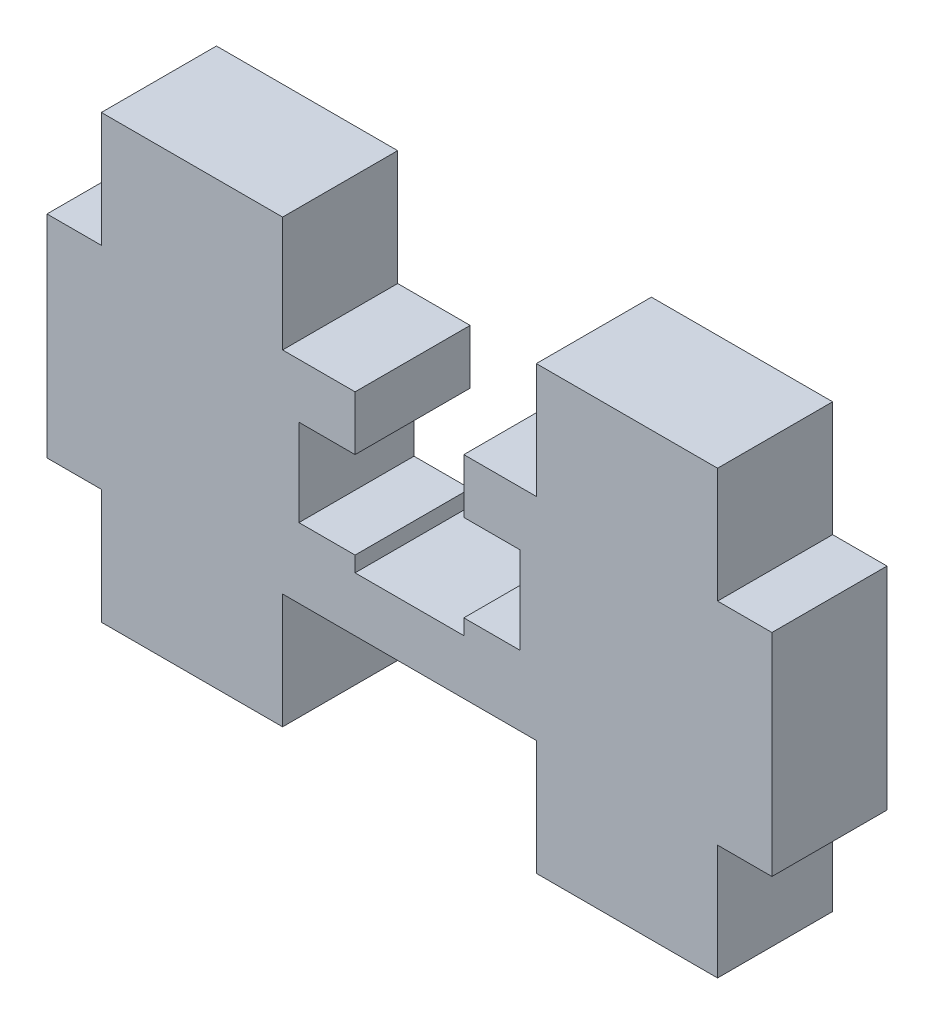
ISO-10303-21;
HEADER;
FILE_DESCRIPTION(('STEP AP214'),'2;1');
FILE_NAME('part.step','',(''),(''),'','','');
FILE_SCHEMA(('AUTOMOTIVE_DESIGN { 1 0 10303 214 1 1 1 1 }'));
ENDSEC;
DATA;
#1=APPLICATION_CONTEXT('core data for automotive mechanical design processes');
#2=APPLICATION_PROTOCOL_DEFINITION('international standard','automotive_design',2000,#1);
#3=PRODUCT_CONTEXT('',#1,'mechanical');
#4=PRODUCT('Part','Part','',(#3));
#5=PRODUCT_RELATED_PRODUCT_CATEGORY('part','',(#4));
#6=PRODUCT_DEFINITION_FORMATION('','',#4);
#7=PRODUCT_DEFINITION_CONTEXT('part definition',#1,'design');
#8=PRODUCT_DEFINITION('design','',#6,#7);
#9=PRODUCT_DEFINITION_SHAPE('','',#8);
#10=(LENGTH_UNIT() NAMED_UNIT(*) SI_UNIT(.MILLI.,.METRE.));
#11=(NAMED_UNIT(*) PLANE_ANGLE_UNIT() SI_UNIT($,.RADIAN.));
#12=(NAMED_UNIT(*) SI_UNIT($,.STERADIAN.) SOLID_ANGLE_UNIT());
#13=UNCERTAINTY_MEASURE_WITH_UNIT(LENGTH_MEASURE(1.E-05),#10,'distance_accuracy_value','');
#14=(GEOMETRIC_REPRESENTATION_CONTEXT(3) GLOBAL_UNCERTAINTY_ASSIGNED_CONTEXT((#13)) GLOBAL_UNIT_ASSIGNED_CONTEXT((#10,
#11,#12)) REPRESENTATION_CONTEXT('',''));
#15=CARTESIAN_POINT('',(0.,0.,0.));
#16=DIRECTION('',(0.,0.,1.));
#17=DIRECTION('',(1.,0.,0.));
#18=AXIS2_PLACEMENT_3D('',#15,#16,#17);
#19=CARTESIAN_POINT('',(-3.5,2.915,3.175));
#20=DIRECTION('',(0.,-1.,0.));
#21=DIRECTION('',(1.,0.,0.));
#22=AXIS2_PLACEMENT_3D('',#19,#20,#21);
#23=PLANE('',#22);
#24=DIRECTION('',(-1.,0.,0.));
#25=VECTOR('',#24,1.);
#26=CARTESIAN_POINT('',(-3.5,2.915,0.));
#27=LINE('',#26,#25);
#28=CARTESIAN_POINT('',(3.5,2.915,0.));
#29=VERTEX_POINT('',#28);
#30=CARTESIAN_POINT('',(1.5,2.915,0.));
#31=VERTEX_POINT('',#30);
#32=EDGE_CURVE('E271',#29,#31,#27,.T.);
#33=ORIENTED_EDGE('',*,*,#32,.T.);
#34=DIRECTION('',(0.,0.,1.));
#35=VECTOR('',#34,1.);
#36=CARTESIAN_POINT('',(1.5,2.915,0.));
#37=LINE('',#36,#35);
#38=CARTESIAN_POINT('',(1.5,2.915,3.175));
#39=VERTEX_POINT('',#38);
#40=EDGE_CURVE('E231',#31,#39,#37,.T.);
#41=ORIENTED_EDGE('',*,*,#40,.T.);
#42=DIRECTION('',(-1.,0.,0.));
#43=VECTOR('',#42,1.);
#44=CARTESIAN_POINT('',(-3.5,2.915,3.175));
#45=LINE('',#44,#43);
#46=CARTESIAN_POINT('',(3.5,2.915,3.175));
#47=VERTEX_POINT('',#46);
#48=EDGE_CURVE('E410',#47,#39,#45,.T.);
#49=ORIENTED_EDGE('',*,*,#48,.F.);
#50=DIRECTION('',(0.,0.,-1.));
#51=VECTOR('',#50,1.);
#52=CARTESIAN_POINT('',(3.5,2.915,3.175));
#53=LINE('',#52,#51);
#54=EDGE_CURVE('E303',#47,#29,#53,.T.);
#55=ORIENTED_EDGE('',*,*,#54,.T.);
#56=EDGE_LOOP('',(#33,#41,#49,#55));
#57=FACE_BOUND('',#56,.T.);
#58=ADVANCED_FACE('F39',(#57),#23,.F.);
#59=CARTESIAN_POINT('',(-10.,-2.915,3.175));
#60=DIRECTION('',(0.,1.,0.));
#61=DIRECTION('',(0.,0.,1.));
#62=AXIS2_PLACEMENT_3D('',#59,#60,#61);
#63=PLANE('',#62);
#64=DIRECTION('',(1.,0.,0.));
#65=VECTOR('',#64,1.);
#66=CARTESIAN_POINT('',(-10.,-2.915,0.));
#67=LINE('',#66,#65);
#68=CARTESIAN_POINT('',(-10.,-2.915,0.));
#69=VERTEX_POINT('',#68);
#70=CARTESIAN_POINT('',(-8.5,-2.915,0.));
#71=VERTEX_POINT('',#70);
#72=EDGE_CURVE('E226',#69,#71,#67,.T.);
#73=ORIENTED_EDGE('',*,*,#72,.T.);
#74=DIRECTION('',(0.,0.,-1.));
#75=VECTOR('',#74,1.);
#76=CARTESIAN_POINT('',(-8.5,-2.915,3.175));
#77=LINE('',#76,#75);
#78=CARTESIAN_POINT('',(-8.5,-2.915,3.175));
#79=VERTEX_POINT('',#78);
#80=EDGE_CURVE('E11',#79,#71,#77,.T.);
#81=ORIENTED_EDGE('',*,*,#80,.F.);
#82=DIRECTION('',(1.,0.,0.));
#83=VECTOR('',#82,1.);
#84=CARTESIAN_POINT('',(-10.,-2.915,3.175));
#85=LINE('',#84,#83);
#86=CARTESIAN_POINT('',(-10.,-2.915,3.175));
#87=VERTEX_POINT('',#86);
#88=EDGE_CURVE('E288',#87,#79,#85,.T.);
#89=ORIENTED_EDGE('',*,*,#88,.F.);
#90=DIRECTION('',(0.,0.,-1.));
#91=VECTOR('',#90,1.);
#92=CARTESIAN_POINT('',(-10.,-2.915,3.175));
#93=LINE('',#92,#91);
#94=EDGE_CURVE('E222',#87,#69,#93,.T.);
#95=ORIENTED_EDGE('',*,*,#94,.T.);
#96=EDGE_LOOP('',(#73,#81,#89,#95));
#97=FACE_BOUND('',#96,.T.);
#98=ADVANCED_FACE('F41',(#97),#63,.F.);
#99=CARTESIAN_POINT('',(-8.5,-2.915,3.175));
#100=DIRECTION('',(1.,0.,0.));
#101=DIRECTION('',(0.,1.,0.));
#102=AXIS2_PLACEMENT_3D('',#99,#100,#101);
#103=PLANE('',#102);
#104=DIRECTION('',(0.,-1.,0.));
#105=VECTOR('',#104,1.);
#106=CARTESIAN_POINT('',(-8.5,-2.915,0.));
#107=LINE('',#106,#105);
#108=CARTESIAN_POINT('',(-8.5,-6.09,0.));
#109=VERTEX_POINT('',#108);
#110=EDGE_CURVE('E230',#71,#109,#107,.T.);
#111=ORIENTED_EDGE('',*,*,#110,.T.);
#112=DIRECTION('',(0.,0.,-1.));
#113=VECTOR('',#112,1.);
#114=CARTESIAN_POINT('',(-8.5,-6.09,3.175));
#115=LINE('',#114,#113);
#116=CARTESIAN_POINT('',(-8.5,-6.09,3.175));
#117=VERTEX_POINT('',#116);
#118=EDGE_CURVE('E48',#117,#109,#115,.T.);
#119=ORIENTED_EDGE('',*,*,#118,.F.);
#120=DIRECTION('',(0.,-1.,0.));
#121=VECTOR('',#120,1.);
#122=CARTESIAN_POINT('',(-8.5,-2.915,3.175));
#123=LINE('',#122,#121);
#124=EDGE_CURVE('E141',#79,#117,#123,.T.);
#125=ORIENTED_EDGE('',*,*,#124,.F.);
#126=ORIENTED_EDGE('',*,*,#80,.T.);
#127=EDGE_LOOP('',(#111,#119,#125,#126));
#128=FACE_BOUND('',#127,.T.);
#129=ADVANCED_FACE('F683',(#128),#103,.F.);
#130=CARTESIAN_POINT('',(-8.5,-6.09,3.175));
#131=DIRECTION('',(0.,1.,0.));
#132=DIRECTION('',(-1.,0.,0.));
#133=AXIS2_PLACEMENT_3D('',#130,#131,#132);
#134=PLANE('',#133);
#135=DIRECTION('',(1.,0.,0.));
#136=VECTOR('',#135,1.);
#137=CARTESIAN_POINT('',(-8.5,-6.09,0.));
#138=LINE('',#137,#136);
#139=CARTESIAN_POINT('',(-3.5,-6.09,0.));
#140=VERTEX_POINT('',#139);
#141=EDGE_CURVE('E234',#109,#140,#138,.T.);
#142=ORIENTED_EDGE('',*,*,#141,.T.);
#143=DIRECTION('',(0.,0.,-1.));
#144=VECTOR('',#143,1.);
#145=CARTESIAN_POINT('',(-3.5,-6.09,3.175));
#146=LINE('',#145,#144);
#147=CARTESIAN_POINT('',(-3.5,-6.09,3.175));
#148=VERTEX_POINT('',#147);
#149=EDGE_CURVE('E347',#148,#140,#146,.T.);
#150=ORIENTED_EDGE('',*,*,#149,.F.);
#151=DIRECTION('',(1.,0.,0.));
#152=VECTOR('',#151,1.);
#153=CARTESIAN_POINT('',(-8.5,-6.09,3.175));
#154=LINE('',#153,#152);
#155=EDGE_CURVE('E357',#117,#148,#154,.T.);
#156=ORIENTED_EDGE('',*,*,#155,.F.);
#157=ORIENTED_EDGE('',*,*,#118,.T.);
#158=EDGE_LOOP('',(#142,#150,#156,#157));
#159=FACE_BOUND('',#158,.T.);
#160=ADVANCED_FACE('F355',(#159),#134,.F.);
#161=CARTESIAN_POINT('',(-3.5,-6.09,3.175));
#162=DIRECTION('',(-1.,0.,0.));
#163=DIRECTION('',(0.,-1.,0.));
#164=AXIS2_PLACEMENT_3D('',#161,#162,#163);
#165=PLANE('',#164);
#166=DIRECTION('',(0.,1.,0.));
#167=VECTOR('',#166,1.);
#168=CARTESIAN_POINT('',(-3.5,-6.09,0.));
#169=LINE('',#168,#167);
#170=CARTESIAN_POINT('',(-3.5,-2.915,0.));
#171=VERTEX_POINT('',#170);
#172=EDGE_CURVE('E237',#140,#171,#169,.T.);
#173=ORIENTED_EDGE('',*,*,#172,.T.);
#174=DIRECTION('',(0.,0.,-1.));
#175=VECTOR('',#174,1.);
#176=CARTESIAN_POINT('',(-3.5,-2.915,3.175));
#177=LINE('',#176,#175);
#178=CARTESIAN_POINT('',(-3.5,-2.915,3.175));
#179=VERTEX_POINT('',#178);
#180=EDGE_CURVE('E343',#179,#171,#177,.T.);
#181=ORIENTED_EDGE('',*,*,#180,.F.);
#182=DIRECTION('',(0.,1.,0.));
#183=VECTOR('',#182,1.);
#184=CARTESIAN_POINT('',(-3.5,-6.09,3.175));
#185=LINE('',#184,#183);
#186=EDGE_CURVE('E377',#148,#179,#185,.T.);
#187=ORIENTED_EDGE('',*,*,#186,.F.);
#188=ORIENTED_EDGE('',*,*,#149,.T.);
#189=EDGE_LOOP('',(#173,#181,#187,#188));
#190=FACE_BOUND('',#189,.T.);
#191=ADVANCED_FACE('F367',(#190),#165,.F.);
#192=CARTESIAN_POINT('',(-3.5,-2.915,3.175));
#193=DIRECTION('',(0.,1.,0.));
#194=DIRECTION('',(-1.,0.,0.));
#195=AXIS2_PLACEMENT_3D('',#192,#193,#194);
#196=PLANE('',#195);
#197=DIRECTION('',(1.,0.,0.));
#198=VECTOR('',#197,1.);
#199=CARTESIAN_POINT('',(-3.5,-2.915,0.));
#200=LINE('',#199,#198);
#201=CARTESIAN_POINT('',(3.5,-2.915,0.));
#202=VERTEX_POINT('',#201);
#203=EDGE_CURVE('E240',#171,#202,#200,.T.);
#204=ORIENTED_EDGE('',*,*,#203,.T.);
#205=DIRECTION('',(0.,0.,-1.));
#206=VECTOR('',#205,1.);
#207=CARTESIAN_POINT('',(3.5,-2.915,3.175));
#208=LINE('',#207,#206);
#209=CARTESIAN_POINT('',(3.5,-2.915,3.175));
#210=VERTEX_POINT('',#209);
#211=EDGE_CURVE('E339',#210,#202,#208,.T.);
#212=ORIENTED_EDGE('',*,*,#211,.F.);
#213=DIRECTION('',(1.,0.,0.));
#214=VECTOR('',#213,1.);
#215=CARTESIAN_POINT('',(-3.5,-2.915,3.175));
#216=LINE('',#215,#214);
#217=EDGE_CURVE('E373',#179,#210,#216,.T.);
#218=ORIENTED_EDGE('',*,*,#217,.F.);
#219=ORIENTED_EDGE('',*,*,#180,.T.);
#220=EDGE_LOOP('',(#204,#212,#218,#219));
#221=FACE_BOUND('',#220,.T.);
#222=ADVANCED_FACE('F371',(#221),#196,.F.);
#223=CARTESIAN_POINT('',(3.5,-6.09,3.175));
#224=DIRECTION('',(1.,0.,0.));
#225=DIRECTION('',(0.,1.,0.));
#226=AXIS2_PLACEMENT_3D('',#223,#224,#225);
#227=PLANE('',#226);
#228=DIRECTION('',(0.,-1.,0.));
#229=VECTOR('',#228,1.);
#230=CARTESIAN_POINT('',(3.5,-6.09,0.));
#231=LINE('',#230,#229);
#232=CARTESIAN_POINT('',(3.5,-6.09,0.));
#233=VERTEX_POINT('',#232);
#234=EDGE_CURVE('E243',#202,#233,#231,.T.);
#235=ORIENTED_EDGE('',*,*,#234,.T.);
#236=DIRECTION('',(0.,0.,-1.));
#237=VECTOR('',#236,1.);
#238=CARTESIAN_POINT('',(3.5,-6.09,3.175));
#239=LINE('',#238,#237);
#240=CARTESIAN_POINT('',(3.5,-6.09,3.175));
#241=VERTEX_POINT('',#240);
#242=EDGE_CURVE('E335',#241,#233,#239,.T.);
#243=ORIENTED_EDGE('',*,*,#242,.F.);
#244=DIRECTION('',(0.,-1.,0.));
#245=VECTOR('',#244,1.);
#246=CARTESIAN_POINT('',(3.5,-6.09,3.175));
#247=LINE('',#246,#245);
#248=EDGE_CURVE('E376',#210,#241,#247,.T.);
#249=ORIENTED_EDGE('',*,*,#248,.F.);
#250=ORIENTED_EDGE('',*,*,#211,.T.);
#251=EDGE_LOOP('',(#235,#243,#249,#250));
#252=FACE_BOUND('',#251,.T.);
#253=ADVANCED_FACE('F723',(#252),#227,.F.);
#254=CARTESIAN_POINT('',(8.5,-6.09,3.175));
#255=DIRECTION('',(0.,1.,0.));
#256=DIRECTION('',(-1.,0.,0.));
#257=AXIS2_PLACEMENT_3D('',#254,#255,#256);
#258=PLANE('',#257);
#259=DIRECTION('',(1.,0.,0.));
#260=VECTOR('',#259,1.);
#261=CARTESIAN_POINT('',(8.5,-6.09,0.));
#262=LINE('',#261,#260);
#263=CARTESIAN_POINT('',(8.5,-6.09,0.));
#264=VERTEX_POINT('',#263);
#265=EDGE_CURVE('E246',#233,#264,#262,.T.);
#266=ORIENTED_EDGE('',*,*,#265,.T.);
#267=DIRECTION('',(0.,0.,-1.));
#268=VECTOR('',#267,1.);
#269=CARTESIAN_POINT('',(8.5,-6.09,3.175));
#270=LINE('',#269,#268);
#271=CARTESIAN_POINT('',(8.5,-6.09,3.175));
#272=VERTEX_POINT('',#271);
#273=EDGE_CURVE('E331',#272,#264,#270,.T.);
#274=ORIENTED_EDGE('',*,*,#273,.F.);
#275=DIRECTION('',(1.,0.,0.));
#276=VECTOR('',#275,1.);
#277=CARTESIAN_POINT('',(8.5,-6.09,3.175));
#278=LINE('',#277,#276);
#279=EDGE_CURVE('E381',#241,#272,#278,.T.);
#280=ORIENTED_EDGE('',*,*,#279,.F.);
#281=ORIENTED_EDGE('',*,*,#242,.T.);
#282=EDGE_LOOP('',(#266,#274,#280,#281));
#283=FACE_BOUND('',#282,.T.);
#284=ADVANCED_FACE('F719',(#283),#258,.F.);
#285=CARTESIAN_POINT('',(8.5,-2.915,3.175));
#286=DIRECTION('',(-1.,0.,0.));
#287=DIRECTION('',(0.,-1.,0.));
#288=AXIS2_PLACEMENT_3D('',#285,#286,#287);
#289=PLANE('',#288);
#290=DIRECTION('',(0.,1.,0.));
#291=VECTOR('',#290,1.);
#292=CARTESIAN_POINT('',(8.5,-2.915,0.));
#293=LINE('',#292,#291);
#294=CARTESIAN_POINT('',(8.5,-2.915,0.));
#295=VERTEX_POINT('',#294);
#296=EDGE_CURVE('E249',#264,#295,#293,.T.);
#297=ORIENTED_EDGE('',*,*,#296,.T.);
#298=DIRECTION('',(0.,0.,-1.));
#299=VECTOR('',#298,1.);
#300=CARTESIAN_POINT('',(8.5,-2.915,3.175));
#301=LINE('',#300,#299);
#302=CARTESIAN_POINT('',(8.5,-2.915,3.175));
#303=VERTEX_POINT('',#302);
#304=EDGE_CURVE('E327',#303,#295,#301,.T.);
#305=ORIENTED_EDGE('',*,*,#304,.F.);
#306=DIRECTION('',(0.,1.,0.));
#307=VECTOR('',#306,1.);
#308=CARTESIAN_POINT('',(8.5,-2.915,3.175));
#309=LINE('',#308,#307);
#310=EDGE_CURVE('E388',#272,#303,#309,.T.);
#311=ORIENTED_EDGE('',*,*,#310,.F.);
#312=ORIENTED_EDGE('',*,*,#273,.T.);
#313=EDGE_LOOP('',(#297,#305,#311,#312));
#314=FACE_BOUND('',#313,.T.);
#315=ADVANCED_FACE('F715',(#314),#289,.F.);
#316=CARTESIAN_POINT('',(10.,-2.915,3.175));
#317=DIRECTION('',(0.,1.,0.));
#318=DIRECTION('',(-1.,0.,0.));
#319=AXIS2_PLACEMENT_3D('',#316,#317,#318);
#320=PLANE('',#319);
#321=DIRECTION('',(1.,0.,0.));
#322=VECTOR('',#321,1.);
#323=CARTESIAN_POINT('',(10.,-2.915,0.));
#324=LINE('',#323,#322);
#325=CARTESIAN_POINT('',(10.,-2.915,0.));
#326=VERTEX_POINT('',#325);
#327=EDGE_CURVE('E252',#295,#326,#324,.T.);
#328=ORIENTED_EDGE('',*,*,#327,.T.);
#329=DIRECTION('',(0.,0.,-1.));
#330=VECTOR('',#329,1.);
#331=CARTESIAN_POINT('',(10.,-2.915,3.175));
#332=LINE('',#331,#330);
#333=CARTESIAN_POINT('',(10.,-2.915,3.175));
#334=VERTEX_POINT('',#333);
#335=EDGE_CURVE('E323',#334,#326,#332,.T.);
#336=ORIENTED_EDGE('',*,*,#335,.F.);
#337=DIRECTION('',(1.,0.,0.));
#338=VECTOR('',#337,1.);
#339=CARTESIAN_POINT('',(10.,-2.915,3.175));
#340=LINE('',#339,#338);
#341=EDGE_CURVE('E391',#303,#334,#340,.T.);
#342=ORIENTED_EDGE('',*,*,#341,.F.);
#343=ORIENTED_EDGE('',*,*,#304,.T.);
#344=EDGE_LOOP('',(#328,#336,#342,#343));
#345=FACE_BOUND('',#344,.T.);
#346=ADVANCED_FACE('F711',(#345),#320,.F.);
#347=CARTESIAN_POINT('',(10.,2.915,3.175));
#348=DIRECTION('',(-1.,0.,0.));
#349=DIRECTION('',(0.,0.,1.));
#350=AXIS2_PLACEMENT_3D('',#347,#348,#349);
#351=PLANE('',#350);
#352=DIRECTION('',(0.,1.,0.));
#353=VECTOR('',#352,1.);
#354=CARTESIAN_POINT('',(10.,2.915,0.));
#355=LINE('',#354,#353);
#356=CARTESIAN_POINT('',(10.,2.915,0.));
#357=VERTEX_POINT('',#356);
#358=EDGE_CURVE('E255',#326,#357,#355,.T.);
#359=ORIENTED_EDGE('',*,*,#358,.T.);
#360=DIRECTION('',(0.,0.,-1.));
#361=VECTOR('',#360,1.);
#362=CARTESIAN_POINT('',(10.,2.915,3.175));
#363=LINE('',#362,#361);
#364=CARTESIAN_POINT('',(10.,2.915,3.175));
#365=VERTEX_POINT('',#364);
#366=EDGE_CURVE('E319',#365,#357,#363,.T.);
#367=ORIENTED_EDGE('',*,*,#366,.F.);
#368=DIRECTION('',(0.,1.,0.));
#369=VECTOR('',#368,1.);
#370=CARTESIAN_POINT('',(10.,2.915,3.175));
#371=LINE('',#370,#369);
#372=EDGE_CURVE('E394',#334,#365,#371,.T.);
#373=ORIENTED_EDGE('',*,*,#372,.F.);
#374=ORIENTED_EDGE('',*,*,#335,.T.);
#375=EDGE_LOOP('',(#359,#367,#373,#374));
#376=FACE_BOUND('',#375,.T.);
#377=ADVANCED_FACE('F707',(#376),#351,.F.);
#378=CARTESIAN_POINT('',(10.,2.915,3.175));
#379=DIRECTION('',(0.,-1.,0.));
#380=DIRECTION('',(1.,0.,0.));
#381=AXIS2_PLACEMENT_3D('',#378,#379,#380);
#382=PLANE('',#381);
#383=DIRECTION('',(-1.,0.,0.));
#384=VECTOR('',#383,1.);
#385=CARTESIAN_POINT('',(10.,2.915,0.));
#386=LINE('',#385,#384);
#387=CARTESIAN_POINT('',(8.5,2.915,0.));
#388=VERTEX_POINT('',#387);
#389=EDGE_CURVE('E258',#357,#388,#386,.T.);
#390=ORIENTED_EDGE('',*,*,#389,.T.);
#391=DIRECTION('',(0.,0.,-1.));
#392=VECTOR('',#391,1.);
#393=CARTESIAN_POINT('',(8.5,2.915,3.175));
#394=LINE('',#393,#392);
#395=CARTESIAN_POINT('',(8.5,2.915,3.175));
#396=VERTEX_POINT('',#395);
#397=EDGE_CURVE('E315',#396,#388,#394,.T.);
#398=ORIENTED_EDGE('',*,*,#397,.F.);
#399=DIRECTION('',(-1.,0.,0.));
#400=VECTOR('',#399,1.);
#401=CARTESIAN_POINT('',(10.,2.915,3.175));
#402=LINE('',#401,#400);
#403=EDGE_CURVE('E397',#365,#396,#402,.T.);
#404=ORIENTED_EDGE('',*,*,#403,.F.);
#405=ORIENTED_EDGE('',*,*,#366,.T.);
#406=EDGE_LOOP('',(#390,#398,#404,#405));
#407=FACE_BOUND('',#406,.T.);
#408=ADVANCED_FACE('F703',(#407),#382,.F.);
#409=CARTESIAN_POINT('',(8.5,2.915,3.175));
#410=DIRECTION('',(-1.,0.,0.));
#411=DIRECTION('',(0.,-1.,0.));
#412=AXIS2_PLACEMENT_3D('',#409,#410,#411);
#413=PLANE('',#412);
#414=DIRECTION('',(0.,1.,0.));
#415=VECTOR('',#414,1.);
#416=CARTESIAN_POINT('',(8.5,2.915,0.));
#417=LINE('',#416,#415);
#418=CARTESIAN_POINT('',(8.5,6.09,0.));
#419=VERTEX_POINT('',#418);
#420=EDGE_CURVE('E261',#388,#419,#417,.T.);
#421=ORIENTED_EDGE('',*,*,#420,.T.);
#422=DIRECTION('',(0.,0.,-1.));
#423=VECTOR('',#422,1.);
#424=CARTESIAN_POINT('',(8.5,6.09,3.175));
#425=LINE('',#424,#423);
#426=CARTESIAN_POINT('',(8.5,6.09,3.175));
#427=VERTEX_POINT('',#426);
#428=EDGE_CURVE('E311',#427,#419,#425,.T.);
#429=ORIENTED_EDGE('',*,*,#428,.F.);
#430=DIRECTION('',(0.,1.,0.));
#431=VECTOR('',#430,1.);
#432=CARTESIAN_POINT('',(8.5,2.915,3.175));
#433=LINE('',#432,#431);
#434=EDGE_CURVE('E400',#396,#427,#433,.T.);
#435=ORIENTED_EDGE('',*,*,#434,.F.);
#436=ORIENTED_EDGE('',*,*,#397,.T.);
#437=EDGE_LOOP('',(#421,#429,#435,#436));
#438=FACE_BOUND('',#437,.T.);
#439=ADVANCED_FACE('F697',(#438),#413,.F.);
#440=CARTESIAN_POINT('',(8.5,6.09,3.175));
#441=DIRECTION('',(0.,-1.,0.));
#442=DIRECTION('',(0.,0.,-1.));
#443=AXIS2_PLACEMENT_3D('',#440,#441,#442);
#444=PLANE('',#443);
#445=DIRECTION('',(-1.,0.,0.));
#446=VECTOR('',#445,1.);
#447=CARTESIAN_POINT('',(8.5,6.09,0.));
#448=LINE('',#447,#446);
#449=CARTESIAN_POINT('',(3.5,6.09,0.));
#450=VERTEX_POINT('',#449);
#451=EDGE_CURVE('E264',#419,#450,#448,.T.);
#452=ORIENTED_EDGE('',*,*,#451,.T.);
#453=DIRECTION('',(0.,0.,-1.));
#454=VECTOR('',#453,1.);
#455=CARTESIAN_POINT('',(3.5,6.09,3.175));
#456=LINE('',#455,#454);
#457=CARTESIAN_POINT('',(3.5,6.09,3.175));
#458=VERTEX_POINT('',#457);
#459=EDGE_CURVE('E307',#458,#450,#456,.T.);
#460=ORIENTED_EDGE('',*,*,#459,.F.);
#461=DIRECTION('',(-1.,0.,0.));
#462=VECTOR('',#461,1.);
#463=CARTESIAN_POINT('',(8.5,6.09,3.175));
#464=LINE('',#463,#462);
#465=EDGE_CURVE('E403',#427,#458,#464,.T.);
#466=ORIENTED_EDGE('',*,*,#465,.F.);
#467=ORIENTED_EDGE('',*,*,#428,.T.);
#468=EDGE_LOOP('',(#452,#460,#466,#467));
#469=FACE_BOUND('',#468,.T.);
#470=ADVANCED_FACE('F692',(#469),#444,.F.);
#471=CARTESIAN_POINT('',(3.5,6.09,3.175));
#472=DIRECTION('',(1.,0.,0.));
#473=DIRECTION('',(0.,0.,-1.));
#474=AXIS2_PLACEMENT_3D('',#471,#472,#473);
#475=PLANE('',#474);
#476=DIRECTION('',(0.,-1.,0.));
#477=VECTOR('',#476,1.);
#478=CARTESIAN_POINT('',(3.5,6.09,0.));
#479=LINE('',#478,#477);
#480=EDGE_CURVE('E267',#450,#29,#479,.T.);
#481=ORIENTED_EDGE('',*,*,#480,.T.);
#482=ORIENTED_EDGE('',*,*,#54,.F.);
#483=DIRECTION('',(0.,-1.,0.));
#484=VECTOR('',#483,1.);
#485=CARTESIAN_POINT('',(3.5,6.09,3.175));
#486=LINE('',#485,#484);
#487=EDGE_CURVE('E406',#458,#47,#486,.T.);
#488=ORIENTED_EDGE('',*,*,#487,.F.);
#489=ORIENTED_EDGE('',*,*,#459,.T.);
#490=EDGE_LOOP('',(#481,#482,#488,#489));
#491=FACE_BOUND('',#490,.T.);
#492=ADVANCED_FACE('F687',(#491),#475,.F.);
#493=CARTESIAN_POINT('',(-1.5,2.915,3.175));
#494=VERTEX_POINT('',#493);
#495=CARTESIAN_POINT('',(-3.5,2.915,3.175));
#496=VERTEX_POINT('',#495);
#497=EDGE_CURVE('E409',#494,#496,#45,.T.);
#498=ORIENTED_EDGE('',*,*,#497,.F.);
#499=DIRECTION('',(0.,0.,1.));
#500=VECTOR('',#499,1.);
#501=CARTESIAN_POINT('',(-1.5,2.915,0.));
#502=LINE('',#501,#500);
#503=CARTESIAN_POINT('',(-1.5,2.915,0.));
#504=VERTEX_POINT('',#503);
#505=EDGE_CURVE('E445',#504,#494,#502,.T.);
#506=ORIENTED_EDGE('',*,*,#505,.F.);
#507=CARTESIAN_POINT('',(-3.5,2.915,0.));
#508=VERTEX_POINT('',#507);
#509=EDGE_CURVE('E270',#504,#508,#27,.T.);
#510=ORIENTED_EDGE('',*,*,#509,.T.);
#511=DIRECTION('',(0.,0.,-1.));
#512=VECTOR('',#511,1.);
#513=CARTESIAN_POINT('',(-3.5,2.915,3.175));
#514=LINE('',#513,#512);
#515=EDGE_CURVE('E299',#496,#508,#514,.T.);
#516=ORIENTED_EDGE('',*,*,#515,.F.);
#517=EDGE_LOOP('',(#498,#506,#510,#516));
#518=FACE_BOUND('',#517,.T.);
#519=ADVANCED_FACE('F428',(#518),#23,.F.);
#520=CARTESIAN_POINT('',(-3.5,6.09,3.175));
#521=DIRECTION('',(-1.,0.,0.));
#522=DIRECTION('',(0.,-1.,0.));
#523=AXIS2_PLACEMENT_3D('',#520,#521,#522);
#524=PLANE('',#523);
#525=DIRECTION('',(0.,1.,0.));
#526=VECTOR('',#525,1.);
#527=CARTESIAN_POINT('',(-3.5,6.09,0.));
#528=LINE('',#527,#526);
#529=CARTESIAN_POINT('',(-3.5,6.09,0.));
#530=VERTEX_POINT('',#529);
#531=EDGE_CURVE('E275',#508,#530,#528,.T.);
#532=ORIENTED_EDGE('',*,*,#531,.T.);
#533=DIRECTION('',(0.,0.,-1.));
#534=VECTOR('',#533,1.);
#535=CARTESIAN_POINT('',(-3.5,6.09,3.175));
#536=LINE('',#535,#534);
#537=CARTESIAN_POINT('',(-3.5,6.09,3.175));
#538=VERTEX_POINT('',#537);
#539=EDGE_CURVE('E295',#538,#530,#536,.T.);
#540=ORIENTED_EDGE('',*,*,#539,.F.);
#541=DIRECTION('',(0.,1.,0.));
#542=VECTOR('',#541,1.);
#543=CARTESIAN_POINT('',(-3.5,6.09,3.175));
#544=LINE('',#543,#542);
#545=EDGE_CURVE('E413',#496,#538,#544,.T.);
#546=ORIENTED_EDGE('',*,*,#545,.F.);
#547=ORIENTED_EDGE('',*,*,#515,.T.);
#548=EDGE_LOOP('',(#532,#540,#546,#547));
#549=FACE_BOUND('',#548,.T.);
#550=ADVANCED_FACE('F432',(#549),#524,.F.);
#551=CARTESIAN_POINT('',(-8.5,6.09,3.175));
#552=DIRECTION('',(0.,-1.,0.));
#553=DIRECTION('',(1.,0.,0.));
#554=AXIS2_PLACEMENT_3D('',#551,#552,#553);
#555=PLANE('',#554);
#556=DIRECTION('',(-1.,0.,0.));
#557=VECTOR('',#556,1.);
#558=CARTESIAN_POINT('',(-8.5,6.09,0.));
#559=LINE('',#558,#557);
#560=CARTESIAN_POINT('',(-8.5,6.09,0.));
#561=VERTEX_POINT('',#560);
#562=EDGE_CURVE('E278',#530,#561,#559,.T.);
#563=ORIENTED_EDGE('',*,*,#562,.T.);
#564=DIRECTION('',(0.,0.,-1.));
#565=VECTOR('',#564,1.);
#566=CARTESIAN_POINT('',(-8.5,6.09,3.175));
#567=LINE('',#566,#565);
#568=CARTESIAN_POINT('',(-8.5,6.09,3.175));
#569=VERTEX_POINT('',#568);
#570=EDGE_CURVE('E215',#569,#561,#567,.T.);
#571=ORIENTED_EDGE('',*,*,#570,.F.);
#572=DIRECTION('',(-1.,0.,0.));
#573=VECTOR('',#572,1.);
#574=CARTESIAN_POINT('',(-8.5,6.09,3.175));
#575=LINE('',#574,#573);
#576=EDGE_CURVE('E201',#538,#569,#575,.T.);
#577=ORIENTED_EDGE('',*,*,#576,.F.);
#578=ORIENTED_EDGE('',*,*,#539,.T.);
#579=EDGE_LOOP('',(#563,#571,#577,#578));
#580=FACE_BOUND('',#579,.T.);
#581=ADVANCED_FACE('F435',(#580),#555,.F.);
#582=CARTESIAN_POINT('',(-8.5,2.915,3.175));
#583=DIRECTION('',(1.,0.,0.));
#584=DIRECTION('',(0.,1.,0.));
#585=AXIS2_PLACEMENT_3D('',#582,#583,#584);
#586=PLANE('',#585);
#587=DIRECTION('',(0.,-1.,0.));
#588=VECTOR('',#587,1.);
#589=CARTESIAN_POINT('',(-8.5,2.915,0.));
#590=LINE('',#589,#588);
#591=CARTESIAN_POINT('',(-8.5,2.915,0.));
#592=VERTEX_POINT('',#591);
#593=EDGE_CURVE('E211',#561,#592,#590,.T.);
#594=ORIENTED_EDGE('',*,*,#593,.T.);
#595=DIRECTION('',(0.,0.,-1.));
#596=VECTOR('',#595,1.);
#597=CARTESIAN_POINT('',(-8.5,2.915,3.175));
#598=LINE('',#597,#596);
#599=CARTESIAN_POINT('',(-8.5,2.915,3.175));
#600=VERTEX_POINT('',#599);
#601=EDGE_CURVE('E208',#600,#592,#598,.T.);
#602=ORIENTED_EDGE('',*,*,#601,.F.);
#603=DIRECTION('',(0.,-1.,0.));
#604=VECTOR('',#603,1.);
#605=CARTESIAN_POINT('',(-8.5,2.915,3.175));
#606=LINE('',#605,#604);
#607=EDGE_CURVE('E193',#569,#600,#606,.T.);
#608=ORIENTED_EDGE('',*,*,#607,.F.);
#609=ORIENTED_EDGE('',*,*,#570,.T.);
#610=EDGE_LOOP('',(#594,#602,#608,#609));
#611=FACE_BOUND('',#610,.T.);
#612=ADVANCED_FACE('F209',(#611),#586,.F.);
#613=CARTESIAN_POINT('',(-10.,2.915,3.175));
#614=DIRECTION('',(0.,-1.,0.));
#615=DIRECTION('',(1.,0.,0.));
#616=AXIS2_PLACEMENT_3D('',#613,#614,#615);
#617=PLANE('',#616);
#618=DIRECTION('',(-1.,0.,0.));
#619=VECTOR('',#618,1.);
#620=CARTESIAN_POINT('',(-10.,2.915,0.));
#621=LINE('',#620,#619);
#622=CARTESIAN_POINT('',(-10.,2.915,0.));
#623=VERTEX_POINT('',#622);
#624=EDGE_CURVE('E283',#592,#623,#621,.T.);
#625=ORIENTED_EDGE('',*,*,#624,.T.);
#626=DIRECTION('',(0.,0.,-1.));
#627=VECTOR('',#626,1.);
#628=CARTESIAN_POINT('',(-10.,2.915,3.175));
#629=LINE('',#628,#627);
#630=CARTESIAN_POINT('',(-10.,2.915,3.175));
#631=VERTEX_POINT('',#630);
#632=EDGE_CURVE('E216',#631,#623,#629,.T.);
#633=ORIENTED_EDGE('',*,*,#632,.F.);
#634=DIRECTION('',(-1.,0.,0.));
#635=VECTOR('',#634,1.);
#636=CARTESIAN_POINT('',(-10.,2.915,3.175));
#637=LINE('',#636,#635);
#638=EDGE_CURVE('E198',#600,#631,#637,.T.);
#639=ORIENTED_EDGE('',*,*,#638,.F.);
#640=ORIENTED_EDGE('',*,*,#601,.T.);
#641=EDGE_LOOP('',(#625,#633,#639,#640));
#642=FACE_BOUND('',#641,.T.);
#643=ADVANCED_FACE('F218',(#642),#617,.F.);
#644=CARTESIAN_POINT('',(-10.,2.915,3.175));
#645=DIRECTION('',(1.,0.,0.));
#646=DIRECTION('',(0.,0.,-1.));
#647=AXIS2_PLACEMENT_3D('',#644,#645,#646);
#648=PLANE('',#647);
#649=DIRECTION('',(0.,-1.,0.));
#650=VECTOR('',#649,1.);
#651=CARTESIAN_POINT('',(-10.,2.915,0.));
#652=LINE('',#651,#650);
#653=EDGE_CURVE('E133',#623,#69,#652,.T.);
#654=ORIENTED_EDGE('',*,*,#653,.T.);
#655=ORIENTED_EDGE('',*,*,#94,.F.);
#656=DIRECTION('',(0.,-1.,0.));
#657=VECTOR('',#656,1.);
#658=CARTESIAN_POINT('',(-10.,2.915,3.175));
#659=LINE('',#658,#657);
#660=EDGE_CURVE('E64',#631,#87,#659,.T.);
#661=ORIENTED_EDGE('',*,*,#660,.F.);
#662=ORIENTED_EDGE('',*,*,#632,.T.);
#663=EDGE_LOOP('',(#654,#655,#661,#662));
#664=FACE_BOUND('',#663,.T.);
#665=ADVANCED_FACE('F436',(#664),#648,.F.);
#666=CARTESIAN_POINT('',(0.,0.,3.175));
#667=DIRECTION('',(0.,0.,-1.));
#668=DIRECTION('',(-1.,0.,0.));
#669=AXIS2_PLACEMENT_3D('',#666,#667,#668);
#670=PLANE('',#669);
#671=ORIENTED_EDGE('',*,*,#48,.T.);
#672=DIRECTION('',(0.,1.,0.));
#673=VECTOR('',#672,1.);
#674=CARTESIAN_POINT('',(1.5,2.915,3.175));
#675=LINE('',#674,#673);
#676=CARTESIAN_POINT('',(1.5,1.415,3.175));
#677=VERTEX_POINT('',#676);
#678=EDGE_CURVE('E493',#677,#39,#675,.T.);
#679=ORIENTED_EDGE('',*,*,#678,.F.);
#680=DIRECTION('',(-1.,0.,0.));
#681=VECTOR('',#680,1.);
#682=CARTESIAN_POINT('',(1.5,1.415,3.175));
#683=LINE('',#682,#681);
#684=CARTESIAN_POINT('',(3.05,1.415,3.175));
#685=VERTEX_POINT('',#684);
#686=EDGE_CURVE('E498',#685,#677,#683,.T.);
#687=ORIENTED_EDGE('',*,*,#686,.F.);
#688=DIRECTION('',(0.,1.,0.));
#689=VECTOR('',#688,1.);
#690=CARTESIAN_POINT('',(3.05,1.415,3.175));
#691=LINE('',#690,#689);
#692=CARTESIAN_POINT('',(3.05,-0.985000000000002,3.175));
#693=VERTEX_POINT('',#692);
#694=EDGE_CURVE('E502',#693,#685,#691,.T.);
#695=ORIENTED_EDGE('',*,*,#694,.F.);
#696=DIRECTION('',(1.,0.,0.));
#697=VECTOR('',#696,1.);
#698=CARTESIAN_POINT('',(3.05,-0.985000000000002,3.175));
#699=LINE('',#698,#697);
#700=CARTESIAN_POINT('',(1.5,-0.985000000000003,3.175));
#701=VERTEX_POINT('',#700);
#702=EDGE_CURVE('E506',#701,#693,#699,.T.);
#703=ORIENTED_EDGE('',*,*,#702,.F.);
#704=DIRECTION('',(0.,1.,0.));
#705=VECTOR('',#704,1.);
#706=CARTESIAN_POINT('',(1.5,-0.985000000000003,3.175));
#707=LINE('',#706,#705);
#708=CARTESIAN_POINT('',(1.5,-1.41,3.175));
#709=VERTEX_POINT('',#708);
#710=EDGE_CURVE('E510',#709,#701,#707,.T.);
#711=ORIENTED_EDGE('',*,*,#710,.F.);
#712=DIRECTION('',(1.,0.,0.));
#713=VECTOR('',#712,1.);
#714=CARTESIAN_POINT('',(-1.5,-1.41,3.175));
#715=LINE('',#714,#713);
#716=CARTESIAN_POINT('',(-1.5,-1.41,3.175));
#717=VERTEX_POINT('',#716);
#718=EDGE_CURVE('E514',#717,#709,#715,.T.);
#719=ORIENTED_EDGE('',*,*,#718,.F.);
#720=DIRECTION('',(0.,-1.,0.));
#721=VECTOR('',#720,1.);
#722=CARTESIAN_POINT('',(-1.5,-0.985000000000003,3.175));
#723=LINE('',#722,#721);
#724=CARTESIAN_POINT('',(-1.5,-0.985000000000003,3.175));
#725=VERTEX_POINT('',#724);
#726=EDGE_CURVE('E518',#725,#717,#723,.T.);
#727=ORIENTED_EDGE('',*,*,#726,.F.);
#728=DIRECTION('',(1.,0.,0.));
#729=VECTOR('',#728,1.);
#730=CARTESIAN_POINT('',(-3.05,-0.985000000000003,3.175));
#731=LINE('',#730,#729);
#732=CARTESIAN_POINT('',(-3.05,-0.985000000000003,3.175));
#733=VERTEX_POINT('',#732);
#734=EDGE_CURVE('E522',#733,#725,#731,.T.);
#735=ORIENTED_EDGE('',*,*,#734,.F.);
#736=DIRECTION('',(0.,-1.,0.));
#737=VECTOR('',#736,1.);
#738=CARTESIAN_POINT('',(-3.05,1.415,3.175));
#739=LINE('',#738,#737);
#740=CARTESIAN_POINT('',(-3.05,1.415,3.175));
#741=VERTEX_POINT('',#740);
#742=EDGE_CURVE('E526',#741,#733,#739,.T.);
#743=ORIENTED_EDGE('',*,*,#742,.F.);
#744=DIRECTION('',(-1.,0.,0.));
#745=VECTOR('',#744,1.);
#746=CARTESIAN_POINT('',(-1.5,1.415,3.175));
#747=LINE('',#746,#745);
#748=CARTESIAN_POINT('',(-1.5,1.415,3.175));
#749=VERTEX_POINT('',#748);
#750=EDGE_CURVE('E530',#749,#741,#747,.T.);
#751=ORIENTED_EDGE('',*,*,#750,.F.);
#752=DIRECTION('',(0.,-1.,0.));
#753=VECTOR('',#752,1.);
#754=CARTESIAN_POINT('',(-1.5,2.915,3.175));
#755=LINE('',#754,#753);
#756=EDGE_CURVE('E425',#494,#749,#755,.T.);
#757=ORIENTED_EDGE('',*,*,#756,.F.);
#758=ORIENTED_EDGE('',*,*,#497,.T.);
#759=ORIENTED_EDGE('',*,*,#545,.T.);
#760=ORIENTED_EDGE('',*,*,#576,.T.);
#761=ORIENTED_EDGE('',*,*,#607,.T.);
#762=ORIENTED_EDGE('',*,*,#638,.T.);
#763=ORIENTED_EDGE('',*,*,#660,.T.);
#764=ORIENTED_EDGE('',*,*,#88,.T.);
#765=ORIENTED_EDGE('',*,*,#124,.T.);
#766=ORIENTED_EDGE('',*,*,#155,.T.);
#767=ORIENTED_EDGE('',*,*,#186,.T.);
#768=ORIENTED_EDGE('',*,*,#217,.T.);
#769=ORIENTED_EDGE('',*,*,#248,.T.);
#770=ORIENTED_EDGE('',*,*,#279,.T.);
#771=ORIENTED_EDGE('',*,*,#310,.T.);
#772=ORIENTED_EDGE('',*,*,#341,.T.);
#773=ORIENTED_EDGE('',*,*,#372,.T.);
#774=ORIENTED_EDGE('',*,*,#403,.T.);
#775=ORIENTED_EDGE('',*,*,#434,.T.);
#776=ORIENTED_EDGE('',*,*,#465,.T.);
#777=ORIENTED_EDGE('',*,*,#487,.T.);
#778=EDGE_LOOP('',(#671,#679,#687,#695,#703,#711,#719,#727,#735,#743,#751,#757,#758,#759,#760,
#761,#762,#763,#764,#765,#766,#767,#768,#769,#770,#771,#772,#773,#774,#775,#776,#777));
#779=FACE_BOUND('',#778,.T.);
#780=ADVANCED_FACE('F196',(#779),#670,.F.);
#781=CARTESIAN_POINT('',(0.,0.,0.));
#782=DIRECTION('',(0.,0.,-1.));
#783=DIRECTION('',(-1.,0.,0.));
#784=AXIS2_PLACEMENT_3D('',#781,#782,#783);
#785=PLANE('',#784);
#786=DIRECTION('',(0.,1.,0.));
#787=VECTOR('',#786,1.);
#788=CARTESIAN_POINT('',(1.5,2.915,0.));
#789=LINE('',#788,#787);
#790=CARTESIAN_POINT('',(1.5,1.415,0.));
#791=VERTEX_POINT('',#790);
#792=EDGE_CURVE('E451',#791,#31,#789,.T.);
#793=ORIENTED_EDGE('',*,*,#792,.T.);
#794=ORIENTED_EDGE('',*,*,#32,.F.);
#795=ORIENTED_EDGE('',*,*,#480,.F.);
#796=ORIENTED_EDGE('',*,*,#451,.F.);
#797=ORIENTED_EDGE('',*,*,#420,.F.);
#798=ORIENTED_EDGE('',*,*,#389,.F.);
#799=ORIENTED_EDGE('',*,*,#358,.F.);
#800=ORIENTED_EDGE('',*,*,#327,.F.);
#801=ORIENTED_EDGE('',*,*,#296,.F.);
#802=ORIENTED_EDGE('',*,*,#265,.F.);
#803=ORIENTED_EDGE('',*,*,#234,.F.);
#804=ORIENTED_EDGE('',*,*,#203,.F.);
#805=ORIENTED_EDGE('',*,*,#172,.F.);
#806=ORIENTED_EDGE('',*,*,#141,.F.);
#807=ORIENTED_EDGE('',*,*,#110,.F.);
#808=ORIENTED_EDGE('',*,*,#72,.F.);
#809=ORIENTED_EDGE('',*,*,#653,.F.);
#810=ORIENTED_EDGE('',*,*,#624,.F.);
#811=ORIENTED_EDGE('',*,*,#593,.F.);
#812=ORIENTED_EDGE('',*,*,#562,.F.);
#813=ORIENTED_EDGE('',*,*,#531,.F.);
#814=ORIENTED_EDGE('',*,*,#509,.F.);
#815=DIRECTION('',(0.,-1.,0.));
#816=VECTOR('',#815,1.);
#817=CARTESIAN_POINT('',(-1.5,2.915,0.));
#818=LINE('',#817,#816);
#819=CARTESIAN_POINT('',(-1.5,1.415,0.));
#820=VERTEX_POINT('',#819);
#821=EDGE_CURVE('E497',#504,#820,#818,.T.);
#822=ORIENTED_EDGE('',*,*,#821,.T.);
#823=DIRECTION('',(-1.,0.,0.));
#824=VECTOR('',#823,1.);
#825=CARTESIAN_POINT('',(-1.5,1.415,0.));
#826=LINE('',#825,#824);
#827=CARTESIAN_POINT('',(-3.05,1.415,0.));
#828=VERTEX_POINT('',#827);
#829=EDGE_CURVE('E55',#820,#828,#826,.T.);
#830=ORIENTED_EDGE('',*,*,#829,.T.);
#831=DIRECTION('',(0.,-1.,0.));
#832=VECTOR('',#831,1.);
#833=CARTESIAN_POINT('',(-3.05,1.415,0.));
#834=LINE('',#833,#832);
#835=CARTESIAN_POINT('',(-3.05,-0.985000000000003,0.));
#836=VERTEX_POINT('',#835);
#837=EDGE_CURVE('E566',#828,#836,#834,.T.);
#838=ORIENTED_EDGE('',*,*,#837,.T.);
#839=DIRECTION('',(1.,0.,0.));
#840=VECTOR('',#839,1.);
#841=CARTESIAN_POINT('',(-3.05,-0.985000000000003,0.));
#842=LINE('',#841,#840);
#843=CARTESIAN_POINT('',(-1.5,-0.985000000000003,0.));
#844=VERTEX_POINT('',#843);
#845=EDGE_CURVE('E562',#836,#844,#842,.T.);
#846=ORIENTED_EDGE('',*,*,#845,.T.);
#847=DIRECTION('',(0.,-1.,0.));
#848=VECTOR('',#847,1.);
#849=CARTESIAN_POINT('',(-1.5,-0.985000000000003,0.));
#850=LINE('',#849,#848);
#851=CARTESIAN_POINT('',(-1.5,-1.41,0.));
#852=VERTEX_POINT('',#851);
#853=EDGE_CURVE('E558',#844,#852,#850,.T.);
#854=ORIENTED_EDGE('',*,*,#853,.T.);
#855=DIRECTION('',(1.,0.,0.));
#856=VECTOR('',#855,1.);
#857=CARTESIAN_POINT('',(-1.5,-1.41,0.));
#858=LINE('',#857,#856);
#859=CARTESIAN_POINT('',(1.5,-1.41,0.));
#860=VERTEX_POINT('',#859);
#861=EDGE_CURVE('E554',#852,#860,#858,.T.);
#862=ORIENTED_EDGE('',*,*,#861,.T.);
#863=DIRECTION('',(0.,1.,0.));
#864=VECTOR('',#863,1.);
#865=CARTESIAN_POINT('',(1.5,-0.985000000000003,0.));
#866=LINE('',#865,#864);
#867=CARTESIAN_POINT('',(1.5,-0.985000000000003,0.));
#868=VERTEX_POINT('',#867);
#869=EDGE_CURVE('E550',#860,#868,#866,.T.);
#870=ORIENTED_EDGE('',*,*,#869,.T.);
#871=DIRECTION('',(1.,0.,0.));
#872=VECTOR('',#871,1.);
#873=CARTESIAN_POINT('',(3.05,-0.985000000000002,0.));
#874=LINE('',#873,#872);
#875=CARTESIAN_POINT('',(3.05,-0.985000000000002,0.));
#876=VERTEX_POINT('',#875);
#877=EDGE_CURVE('E546',#868,#876,#874,.T.);
#878=ORIENTED_EDGE('',*,*,#877,.T.);
#879=DIRECTION('',(0.,1.,0.));
#880=VECTOR('',#879,1.);
#881=CARTESIAN_POINT('',(3.05,1.415,0.));
#882=LINE('',#881,#880);
#883=CARTESIAN_POINT('',(3.05,1.415,0.));
#884=VERTEX_POINT('',#883);
#885=EDGE_CURVE('E542',#876,#884,#882,.T.);
#886=ORIENTED_EDGE('',*,*,#885,.T.);
#887=DIRECTION('',(-1.,0.,0.));
#888=VECTOR('',#887,1.);
#889=CARTESIAN_POINT('',(1.5,1.415,0.));
#890=LINE('',#889,#888);
#891=EDGE_CURVE('E538',#884,#791,#890,.T.);
#892=ORIENTED_EDGE('',*,*,#891,.T.);
#893=EDGE_LOOP('',(#793,#794,#795,#796,#797,#798,#799,#800,#801,#802,#803,#804,#805,#806,#807,
#808,#809,#810,#811,#812,#813,#814,#822,#830,#838,#846,#854,#862,#870,#878,#886,#892));
#894=FACE_BOUND('',#893,.T.);
#895=ADVANCED_FACE('F361',(#894),#785,.T.);
#896=CARTESIAN_POINT('',(1.5,2.915,0.));
#897=DIRECTION('',(1.,0.,0.));
#898=DIRECTION('',(0.,1.,0.));
#899=AXIS2_PLACEMENT_3D('',#896,#897,#898);
#900=PLANE('',#899);
#901=ORIENTED_EDGE('',*,*,#678,.T.);
#902=ORIENTED_EDGE('',*,*,#40,.F.);
#903=ORIENTED_EDGE('',*,*,#792,.F.);
#904=DIRECTION('',(0.,0.,1.));
#905=VECTOR('',#904,1.);
#906=CARTESIAN_POINT('',(1.5,1.415,0.));
#907=LINE('',#906,#905);
#908=EDGE_CURVE('E486',#791,#677,#907,.T.);
#909=ORIENTED_EDGE('',*,*,#908,.T.);
#910=EDGE_LOOP('',(#901,#902,#903,#909));
#911=FACE_BOUND('',#910,.T.);
#912=ADVANCED_FACE('F629',(#911),#900,.F.);
#913=CARTESIAN_POINT('',(1.5,1.415,0.));
#914=DIRECTION('',(0.,1.,0.));
#915=DIRECTION('',(0.,0.,1.));
#916=AXIS2_PLACEMENT_3D('',#913,#914,#915);
#917=PLANE('',#916);
#918=ORIENTED_EDGE('',*,*,#686,.T.);
#919=ORIENTED_EDGE('',*,*,#908,.F.);
#920=ORIENTED_EDGE('',*,*,#891,.F.);
#921=DIRECTION('',(0.,0.,1.));
#922=VECTOR('',#921,1.);
#923=CARTESIAN_POINT('',(3.05,1.415,0.));
#924=LINE('',#923,#922);
#925=EDGE_CURVE('E482',#884,#685,#924,.T.);
#926=ORIENTED_EDGE('',*,*,#925,.T.);
#927=EDGE_LOOP('',(#918,#919,#920,#926));
#928=FACE_BOUND('',#927,.T.);
#929=ADVANCED_FACE('F634',(#928),#917,.F.);
#930=CARTESIAN_POINT('',(3.05,1.415,0.));
#931=DIRECTION('',(1.,0.,0.));
#932=DIRECTION('',(0.,1.,0.));
#933=AXIS2_PLACEMENT_3D('',#930,#931,#932);
#934=PLANE('',#933);
#935=ORIENTED_EDGE('',*,*,#694,.T.);
#936=ORIENTED_EDGE('',*,*,#925,.F.);
#937=ORIENTED_EDGE('',*,*,#885,.F.);
#938=DIRECTION('',(0.,0.,1.));
#939=VECTOR('',#938,1.);
#940=CARTESIAN_POINT('',(3.05,-0.985000000000002,0.));
#941=LINE('',#940,#939);
#942=EDGE_CURVE('E478',#876,#693,#941,.T.);
#943=ORIENTED_EDGE('',*,*,#942,.T.);
#944=EDGE_LOOP('',(#935,#936,#937,#943));
#945=FACE_BOUND('',#944,.T.);
#946=ADVANCED_FACE('F645',(#945),#934,.F.);
#947=CARTESIAN_POINT('',(3.05,-0.985000000000002,0.));
#948=DIRECTION('',(0.,-1.,0.));
#949=DIRECTION('',(1.,0.,0.));
#950=AXIS2_PLACEMENT_3D('',#947,#948,#949);
#951=PLANE('',#950);
#952=ORIENTED_EDGE('',*,*,#702,.T.);
#953=ORIENTED_EDGE('',*,*,#942,.F.);
#954=ORIENTED_EDGE('',*,*,#877,.F.);
#955=DIRECTION('',(0.,0.,1.));
#956=VECTOR('',#955,1.);
#957=CARTESIAN_POINT('',(1.5,-0.985000000000003,0.));
#958=LINE('',#957,#956);
#959=EDGE_CURVE('E474',#868,#701,#958,.T.);
#960=ORIENTED_EDGE('',*,*,#959,.T.);
#961=EDGE_LOOP('',(#952,#953,#954,#960));
#962=FACE_BOUND('',#961,.T.);
#963=ADVANCED_FACE('F650',(#962),#951,.F.);
#964=CARTESIAN_POINT('',(1.5,-0.985000000000003,0.));
#965=DIRECTION('',(1.,0.,0.));
#966=DIRECTION('',(0.,0.,-1.));
#967=AXIS2_PLACEMENT_3D('',#964,#965,#966);
#968=PLANE('',#967);
#969=ORIENTED_EDGE('',*,*,#710,.T.);
#970=ORIENTED_EDGE('',*,*,#959,.F.);
#971=ORIENTED_EDGE('',*,*,#869,.F.);
#972=DIRECTION('',(0.,0.,1.));
#973=VECTOR('',#972,1.);
#974=CARTESIAN_POINT('',(1.5,-1.41,0.));
#975=LINE('',#974,#973);
#976=EDGE_CURVE('E470',#860,#709,#975,.T.);
#977=ORIENTED_EDGE('',*,*,#976,.T.);
#978=EDGE_LOOP('',(#969,#970,#971,#977));
#979=FACE_BOUND('',#978,.T.);
#980=ADVANCED_FACE('F653',(#979),#968,.F.);
#981=CARTESIAN_POINT('',(-1.5,-1.41,0.));
#982=DIRECTION('',(0.,-1.,0.));
#983=DIRECTION('',(1.,0.,0.));
#984=AXIS2_PLACEMENT_3D('',#981,#982,#983);
#985=PLANE('',#984);
#986=ORIENTED_EDGE('',*,*,#718,.T.);
#987=ORIENTED_EDGE('',*,*,#976,.F.);
#988=ORIENTED_EDGE('',*,*,#861,.F.);
#989=DIRECTION('',(0.,0.,1.));
#990=VECTOR('',#989,1.);
#991=CARTESIAN_POINT('',(-1.5,-1.41,0.));
#992=LINE('',#991,#990);
#993=EDGE_CURVE('E466',#852,#717,#992,.T.);
#994=ORIENTED_EDGE('',*,*,#993,.T.);
#995=EDGE_LOOP('',(#986,#987,#988,#994));
#996=FACE_BOUND('',#995,.T.);
#997=ADVANCED_FACE('F656',(#996),#985,.F.);
#998=CARTESIAN_POINT('',(-1.5,-0.985000000000003,0.));
#999=DIRECTION('',(-1.,0.,0.));
#1000=DIRECTION('',(0.,0.,1.));
#1001=AXIS2_PLACEMENT_3D('',#998,#999,#1000);
#1002=PLANE('',#1001);
#1003=ORIENTED_EDGE('',*,*,#726,.T.);
#1004=ORIENTED_EDGE('',*,*,#993,.F.);
#1005=ORIENTED_EDGE('',*,*,#853,.F.);
#1006=DIRECTION('',(0.,0.,1.));
#1007=VECTOR('',#1006,1.);
#1008=CARTESIAN_POINT('',(-1.5,-0.985000000000003,0.));
#1009=LINE('',#1008,#1007);
#1010=EDGE_CURVE('E462',#844,#725,#1009,.T.);
#1011=ORIENTED_EDGE('',*,*,#1010,.T.);
#1012=EDGE_LOOP('',(#1003,#1004,#1005,#1011));
#1013=FACE_BOUND('',#1012,.T.);
#1014=ADVANCED_FACE('F661',(#1013),#1002,.F.);
#1015=CARTESIAN_POINT('',(-3.05,-0.985000000000003,0.));
#1016=DIRECTION('',(0.,-1.,0.));
#1017=DIRECTION('',(1.,0.,0.));
#1018=AXIS2_PLACEMENT_3D('',#1015,#1016,#1017);
#1019=PLANE('',#1018);
#1020=ORIENTED_EDGE('',*,*,#734,.T.);
#1021=ORIENTED_EDGE('',*,*,#1010,.F.);
#1022=ORIENTED_EDGE('',*,*,#845,.F.);
#1023=DIRECTION('',(0.,0.,1.));
#1024=VECTOR('',#1023,1.);
#1025=CARTESIAN_POINT('',(-3.05,-0.985000000000003,0.));
#1026=LINE('',#1025,#1024);
#1027=EDGE_CURVE('E458',#836,#733,#1026,.T.);
#1028=ORIENTED_EDGE('',*,*,#1027,.T.);
#1029=EDGE_LOOP('',(#1020,#1021,#1022,#1028));
#1030=FACE_BOUND('',#1029,.T.);
#1031=ADVANCED_FACE('F665',(#1030),#1019,.F.);
#1032=CARTESIAN_POINT('',(-3.05,1.415,0.));
#1033=DIRECTION('',(-1.,0.,0.));
#1034=DIRECTION('',(0.,0.,1.));
#1035=AXIS2_PLACEMENT_3D('',#1032,#1033,#1034);
#1036=PLANE('',#1035);
#1037=ORIENTED_EDGE('',*,*,#742,.T.);
#1038=ORIENTED_EDGE('',*,*,#1027,.F.);
#1039=ORIENTED_EDGE('',*,*,#837,.F.);
#1040=DIRECTION('',(0.,0.,1.));
#1041=VECTOR('',#1040,1.);
#1042=CARTESIAN_POINT('',(-3.05,1.415,0.));
#1043=LINE('',#1042,#1041);
#1044=EDGE_CURVE('E454',#828,#741,#1043,.T.);
#1045=ORIENTED_EDGE('',*,*,#1044,.T.);
#1046=EDGE_LOOP('',(#1037,#1038,#1039,#1045));
#1047=FACE_BOUND('',#1046,.T.);
#1048=ADVANCED_FACE('F668',(#1047),#1036,.F.);
#1049=CARTESIAN_POINT('',(-1.5,1.415,0.));
#1050=DIRECTION('',(0.,1.,0.));
#1051=DIRECTION('',(-1.,0.,0.));
#1052=AXIS2_PLACEMENT_3D('',#1049,#1050,#1051);
#1053=PLANE('',#1052);
#1054=ORIENTED_EDGE('',*,*,#750,.T.);
#1055=ORIENTED_EDGE('',*,*,#1044,.F.);
#1056=ORIENTED_EDGE('',*,*,#829,.F.);
#1057=DIRECTION('',(0.,0.,1.));
#1058=VECTOR('',#1057,1.);
#1059=CARTESIAN_POINT('',(-1.5,1.415,0.));
#1060=LINE('',#1059,#1058);
#1061=EDGE_CURVE('E450',#820,#749,#1060,.T.);
#1062=ORIENTED_EDGE('',*,*,#1061,.T.);
#1063=EDGE_LOOP('',(#1054,#1055,#1056,#1062));
#1064=FACE_BOUND('',#1063,.T.);
#1065=ADVANCED_FACE('F669',(#1064),#1053,.F.);
#1066=CARTESIAN_POINT('',(-1.5,2.915,0.));
#1067=DIRECTION('',(-1.,0.,0.));
#1068=DIRECTION('',(0.,-1.,0.));
#1069=AXIS2_PLACEMENT_3D('',#1066,#1067,#1068);
#1070=PLANE('',#1069);
#1071=ORIENTED_EDGE('',*,*,#756,.T.);
#1072=ORIENTED_EDGE('',*,*,#1061,.F.);
#1073=ORIENTED_EDGE('',*,*,#821,.F.);
#1074=ORIENTED_EDGE('',*,*,#505,.T.);
#1075=EDGE_LOOP('',(#1071,#1072,#1073,#1074));
#1076=FACE_BOUND('',#1075,.T.);
#1077=ADVANCED_FACE('F578',(#1076),#1070,.F.);
#1078=CLOSED_SHELL('',(#58,#98,#129,#160,#191,#222,#253,#284,#315,#346,#377,#408,#439,#470,#492,
#519,#550,#581,#612,#643,#665,#780,#895,#912,#929,#946,#963,#980,#997,#1014,#1031,#1048,#1065,#1077));
#1079=MANIFOLD_SOLID_BREP('B2',#1078);
#1080=ADVANCED_BREP_SHAPE_REPRESENTATION('',(#18,#1079),#14);
#1081=SHAPE_DEFINITION_REPRESENTATION(#9,#1080);
ENDSEC;
END-ISO-10303-21;
